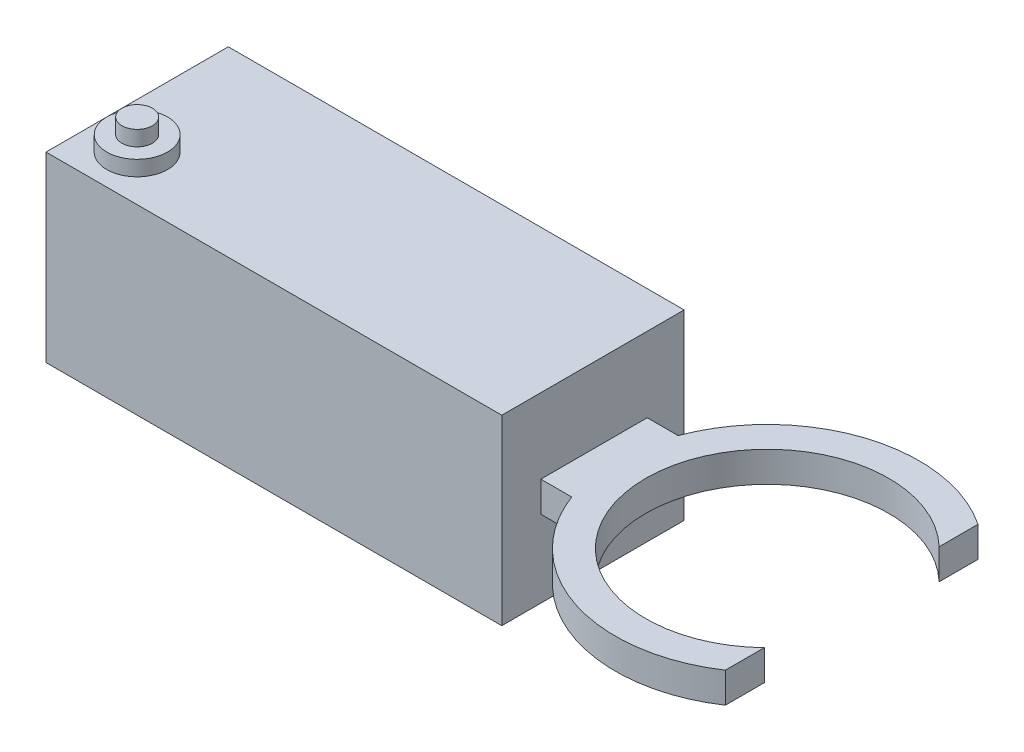
ISO-10303-21;
HEADER;
FILE_DESCRIPTION(('STEP AP214'),'2;1');
FILE_NAME('part.step','',(''),(''),'','','');
FILE_SCHEMA(('AUTOMOTIVE_DESIGN { 1 0 10303 214 1 1 1 1 }'));
ENDSEC;
DATA;
#1=APPLICATION_CONTEXT('core data for automotive mechanical design processes');
#2=APPLICATION_PROTOCOL_DEFINITION('international standard','automotive_design',2000,#1);
#3=PRODUCT_CONTEXT('',#1,'mechanical');
#4=PRODUCT('Part','Part','',(#3));
#5=PRODUCT_RELATED_PRODUCT_CATEGORY('part','',(#4));
#6=PRODUCT_DEFINITION_FORMATION('','',#4);
#7=PRODUCT_DEFINITION_CONTEXT('part definition',#1,'design');
#8=PRODUCT_DEFINITION('design','',#6,#7);
#9=PRODUCT_DEFINITION_SHAPE('','',#8);
#10=(LENGTH_UNIT() NAMED_UNIT(*) SI_UNIT(.MILLI.,.METRE.));
#11=(NAMED_UNIT(*) PLANE_ANGLE_UNIT() SI_UNIT($,.RADIAN.));
#12=(NAMED_UNIT(*) SI_UNIT($,.STERADIAN.) SOLID_ANGLE_UNIT());
#13=UNCERTAINTY_MEASURE_WITH_UNIT(LENGTH_MEASURE(1.E-05),#10,'distance_accuracy_value','');
#14=(GEOMETRIC_REPRESENTATION_CONTEXT(3) GLOBAL_UNCERTAINTY_ASSIGNED_CONTEXT((#13)) GLOBAL_UNIT_ASSIGNED_CONTEXT((#10,
#11,#12)) REPRESENTATION_CONTEXT('',''));
#15=CARTESIAN_POINT('',(0.,0.,0.));
#16=DIRECTION('',(0.,0.,1.));
#17=DIRECTION('',(1.,0.,0.));
#18=AXIS2_PLACEMENT_3D('',#15,#16,#17);
#19=CARTESIAN_POINT('',(75.,30.,-60.));
#20=DIRECTION('',(1.,0.,0.));
#21=DIRECTION('',(0.,0.,-1.));
#22=AXIS2_PLACEMENT_3D('',#19,#20,#21);
#23=PLANE('',#22);
#24=DIRECTION('',(0.,1.,0.));
#25=VECTOR('',#24,1.);
#26=CARTESIAN_POINT('',(75.,30.,0.));
#27=LINE('',#26,#25);
#28=CARTESIAN_POINT('',(75.,-30.,0.));
#29=VERTEX_POINT('',#28);
#30=CARTESIAN_POINT('',(75.,30.,0.));
#31=VERTEX_POINT('',#30);
#32=EDGE_CURVE('E223',#29,#31,#27,.T.);
#33=ORIENTED_EDGE('',*,*,#32,.F.);
#34=DIRECTION('',(0.,0.,1.));
#35=VECTOR('',#34,1.);
#36=CARTESIAN_POINT('',(75.,-30.,-60.));
#37=LINE('',#36,#35);
#38=CARTESIAN_POINT('',(75.,-30.,-60.));
#39=VERTEX_POINT('',#38);
#40=EDGE_CURVE('E228',#39,#29,#37,.T.);
#41=ORIENTED_EDGE('',*,*,#40,.F.);
#42=DIRECTION('',(0.,1.,0.));
#43=VECTOR('',#42,1.);
#44=CARTESIAN_POINT('',(75.,30.,-60.));
#45=LINE('',#44,#43);
#46=CARTESIAN_POINT('',(75.,30.,-60.));
#47=VERTEX_POINT('',#46);
#48=EDGE_CURVE('E212',#39,#47,#45,.T.);
#49=ORIENTED_EDGE('',*,*,#48,.T.);
#50=DIRECTION('',(0.,0.,1.));
#51=VECTOR('',#50,1.);
#52=CARTESIAN_POINT('',(75.,30.,-60.));
#53=LINE('',#52,#51);
#54=EDGE_CURVE('E44',#47,#31,#53,.T.);
#55=ORIENTED_EDGE('',*,*,#54,.T.);
#56=EDGE_LOOP('',(#33,#41,#49,#55));
#57=FACE_BOUND('',#56,.T.);
#58=DIRECTION('',(0.,0.,-1.));
#59=VECTOR('',#58,1.);
#60=CARTESIAN_POINT('',(75.,-4.65961704141354,-47.8619356874103));
#61=LINE('',#60,#59);
#62=CARTESIAN_POINT('',(75.,-4.65961704141354,-12.8619356874103));
#63=VERTEX_POINT('',#62);
#64=CARTESIAN_POINT('',(75.,-4.65961704141354,-47.8619356874103));
#65=VERTEX_POINT('',#64);
#66=EDGE_CURVE('E176',#63,#65,#61,.T.);
#67=ORIENTED_EDGE('',*,*,#66,.F.);
#68=DIRECTION('',(0.,-1.,0.));
#69=VECTOR('',#68,1.);
#70=CARTESIAN_POINT('',(75.,5.34038295858646,-12.8619356874103));
#71=LINE('',#70,#69);
#72=CARTESIAN_POINT('',(75.,5.34038295858646,-12.8619356874103));
#73=VERTEX_POINT('',#72);
#74=EDGE_CURVE('E174',#73,#63,#71,.T.);
#75=ORIENTED_EDGE('',*,*,#74,.F.);
#76=DIRECTION('',(0.,0.,1.));
#77=VECTOR('',#76,1.);
#78=CARTESIAN_POINT('',(75.,5.34038295858646,-47.8619356874103));
#79=LINE('',#78,#77);
#80=CARTESIAN_POINT('',(75.,5.34038295858646,-47.8619356874103));
#81=VERTEX_POINT('',#80);
#82=EDGE_CURVE('E182',#81,#73,#79,.T.);
#83=ORIENTED_EDGE('',*,*,#82,.F.);
#84=DIRECTION('',(0.,1.,0.));
#85=VECTOR('',#84,1.);
#86=CARTESIAN_POINT('',(75.,5.34038295858646,-47.8619356874103));
#87=LINE('',#86,#85);
#88=EDGE_CURVE('E179',#65,#81,#87,.T.);
#89=ORIENTED_EDGE('',*,*,#88,.F.);
#90=EDGE_LOOP('',(#67,#75,#83,#89));
#91=FACE_BOUND('',#90,.T.);
#92=ADVANCED_FACE('F35',(#57,#91),#23,.T.);
#93=CARTESIAN_POINT('',(-75.,30.,-60.));
#94=DIRECTION('',(-1.,0.,0.));
#95=DIRECTION('',(0.,-1.,0.));
#96=AXIS2_PLACEMENT_3D('',#93,#94,#95);
#97=PLANE('',#96);
#98=DIRECTION('',(0.,-1.,0.));
#99=VECTOR('',#98,1.);
#100=CARTESIAN_POINT('',(-75.,30.,0.));
#101=LINE('',#100,#99);
#102=CARTESIAN_POINT('',(-75.,30.,0.));
#103=VERTEX_POINT('',#102);
#104=CARTESIAN_POINT('',(-75.,-30.,0.));
#105=VERTEX_POINT('',#104);
#106=EDGE_CURVE('E202',#103,#105,#101,.T.);
#107=ORIENTED_EDGE('',*,*,#106,.F.);
#108=DIRECTION('',(0.,0.,1.));
#109=VECTOR('',#108,1.);
#110=CARTESIAN_POINT('',(-75.,30.,-60.));
#111=LINE('',#110,#109);
#112=CARTESIAN_POINT('',(-75.,30.,-60.));
#113=VERTEX_POINT('',#112);
#114=EDGE_CURVE('E11',#113,#103,#111,.T.);
#115=ORIENTED_EDGE('',*,*,#114,.F.);
#116=DIRECTION('',(0.,-1.,0.));
#117=VECTOR('',#116,1.);
#118=CARTESIAN_POINT('',(-75.,30.,-60.));
#119=LINE('',#118,#117);
#120=CARTESIAN_POINT('',(-75.,-30.,-60.));
#121=VERTEX_POINT('',#120);
#122=EDGE_CURVE('E205',#113,#121,#119,.T.);
#123=ORIENTED_EDGE('',*,*,#122,.T.);
#124=DIRECTION('',(0.,0.,1.));
#125=VECTOR('',#124,1.);
#126=CARTESIAN_POINT('',(-75.,-30.,-60.));
#127=LINE('',#126,#125);
#128=EDGE_CURVE('E39',#121,#105,#127,.T.);
#129=ORIENTED_EDGE('',*,*,#128,.T.);
#130=EDGE_LOOP('',(#107,#115,#123,#129));
#131=FACE_BOUND('',#130,.T.);
#132=ADVANCED_FACE('F37',(#131),#97,.T.);
#133=CARTESIAN_POINT('',(75.,30.,-60.));
#134=DIRECTION('',(0.,1.,0.));
#135=DIRECTION('',(0.,0.,1.));
#136=AXIS2_PLACEMENT_3D('',#133,#134,#135);
#137=PLANE('',#136);
#138=CARTESIAN_POINT('',(-60.,30.,-15.));
#139=DIRECTION('',(0.,1.,0.));
#140=DIRECTION('',(0.,0.,1.));
#141=AXIS2_PLACEMENT_3D('',#138,#139,#140);
#142=CIRCLE('',#141,10.);
#143=CARTESIAN_POINT('',(-60.,30.,-5.));
#144=VERTEX_POINT('',#143);
#145=EDGE_CURVE('E196',#144,#144,#142,.T.);
#146=ORIENTED_EDGE('',*,*,#145,.F.);
#147=EDGE_LOOP('',(#146));
#148=FACE_BOUND('',#147,.T.);
#149=DIRECTION('',(-1.,0.,0.));
#150=VECTOR('',#149,1.);
#151=CARTESIAN_POINT('',(75.,30.,0.));
#152=LINE('',#151,#150);
#153=EDGE_CURVE('E209',#31,#103,#152,.T.);
#154=ORIENTED_EDGE('',*,*,#153,.F.);
#155=ORIENTED_EDGE('',*,*,#54,.F.);
#156=DIRECTION('',(-1.,0.,0.));
#157=VECTOR('',#156,1.);
#158=CARTESIAN_POINT('',(75.,30.,-60.));
#159=LINE('',#158,#157);
#160=EDGE_CURVE('E215',#47,#113,#159,.T.);
#161=ORIENTED_EDGE('',*,*,#160,.T.);
#162=ORIENTED_EDGE('',*,*,#114,.T.);
#163=EDGE_LOOP('',(#154,#155,#161,#162));
#164=FACE_BOUND('',#163,.T.);
#165=ADVANCED_FACE('F241',(#148,#164),#137,.T.);
#166=CARTESIAN_POINT('',(75.,-30.,-60.));
#167=DIRECTION('',(0.,-1.,0.));
#168=DIRECTION('',(1.,0.,0.));
#169=AXIS2_PLACEMENT_3D('',#166,#167,#168);
#170=PLANE('',#169);
#171=DIRECTION('',(1.,0.,0.));
#172=VECTOR('',#171,1.);
#173=CARTESIAN_POINT('',(75.,-30.,0.));
#174=LINE('',#173,#172);
#175=EDGE_CURVE('E220',#105,#29,#174,.T.);
#176=ORIENTED_EDGE('',*,*,#175,.F.);
#177=ORIENTED_EDGE('',*,*,#128,.F.);
#178=DIRECTION('',(1.,0.,0.));
#179=VECTOR('',#178,1.);
#180=CARTESIAN_POINT('',(75.,-30.,-60.));
#181=LINE('',#180,#179);
#182=EDGE_CURVE('E208',#121,#39,#181,.T.);
#183=ORIENTED_EDGE('',*,*,#182,.T.);
#184=ORIENTED_EDGE('',*,*,#40,.T.);
#185=EDGE_LOOP('',(#176,#177,#183,#184));
#186=FACE_BOUND('',#185,.T.);
#187=ADVANCED_FACE('F236',(#186),#170,.T.);
#188=CARTESIAN_POINT('',(0.,0.,-60.));
#189=DIRECTION('',(0.,0.,-1.));
#190=DIRECTION('',(-1.,0.,0.));
#191=AXIS2_PLACEMENT_3D('',#188,#189,#190);
#192=PLANE('',#191);
#193=ORIENTED_EDGE('',*,*,#122,.F.);
#194=ORIENTED_EDGE('',*,*,#160,.F.);
#195=ORIENTED_EDGE('',*,*,#48,.F.);
#196=ORIENTED_EDGE('',*,*,#182,.F.);
#197=EDGE_LOOP('',(#193,#194,#195,#196));
#198=FACE_BOUND('',#197,.T.);
#199=ADVANCED_FACE('F244',(#198),#192,.T.);
#200=CARTESIAN_POINT('',(0.,0.,0.));
#201=DIRECTION('',(0.,0.,-1.));
#202=DIRECTION('',(-1.,0.,0.));
#203=AXIS2_PLACEMENT_3D('',#200,#201,#202);
#204=PLANE('',#203);
#205=ORIENTED_EDGE('',*,*,#106,.T.);
#206=ORIENTED_EDGE('',*,*,#175,.T.);
#207=ORIENTED_EDGE('',*,*,#32,.T.);
#208=ORIENTED_EDGE('',*,*,#153,.T.);
#209=EDGE_LOOP('',(#205,#206,#207,#208));
#210=FACE_BOUND('',#209,.T.);
#211=ADVANCED_FACE('F238',(#210),#204,.F.);
#212=CARTESIAN_POINT('',(-60.,35.,-15.));
#213=DIRECTION('',(0.,-1.,0.));
#214=DIRECTION('',(0.,0.,-1.));
#215=AXIS2_PLACEMENT_3D('',#212,#213,#214);
#216=CYLINDRICAL_SURFACE('',#215,10.);
#217=CARTESIAN_POINT('',(-60.,35.,-15.));
#218=DIRECTION('',(0.,1.,0.));
#219=DIRECTION('',(0.,0.,1.));
#220=AXIS2_PLACEMENT_3D('',#217,#218,#219);
#221=CIRCLE('',#220,10.);
#222=CARTESIAN_POINT('',(-60.,35.,-5.));
#223=VERTEX_POINT('',#222);
#224=EDGE_CURVE('E199',#223,#223,#221,.T.);
#225=ORIENTED_EDGE('',*,*,#224,.F.);
#226=EDGE_LOOP('',(#225));
#227=FACE_BOUND('',#226,.T.);
#228=ORIENTED_EDGE('',*,*,#145,.T.);
#229=EDGE_LOOP('',(#228));
#230=FACE_BOUND('',#229,.T.);
#231=ADVANCED_FACE('F284',(#227,#230),#216,.T.);
#232=CARTESIAN_POINT('',(-60.,35.,-15.));
#233=DIRECTION('',(0.,1.,0.));
#234=DIRECTION('',(0.,0.,1.));
#235=AXIS2_PLACEMENT_3D('',#232,#233,#234);
#236=PLANE('',#235);
#237=CARTESIAN_POINT('',(-60.,35.,-15.));
#238=DIRECTION('',(0.,1.,0.));
#239=DIRECTION('',(0.,0.,1.));
#240=AXIS2_PLACEMENT_3D('',#237,#238,#239);
#241=CIRCLE('',#240,5.);
#242=CARTESIAN_POINT('',(-60.,35.,-10.));
#243=VERTEX_POINT('',#242);
#244=EDGE_CURVE('E192',#243,#243,#241,.T.);
#245=ORIENTED_EDGE('',*,*,#244,.F.);
#246=EDGE_LOOP('',(#245));
#247=FACE_BOUND('',#246,.T.);
#248=ORIENTED_EDGE('',*,*,#224,.T.);
#249=EDGE_LOOP('',(#248));
#250=FACE_BOUND('',#249,.T.);
#251=ADVANCED_FACE('F280',(#247,#250),#236,.T.);
#252=CARTESIAN_POINT('',(-60.,40.,-15.));
#253=DIRECTION('',(0.,-1.,0.));
#254=DIRECTION('',(0.,0.,-1.));
#255=AXIS2_PLACEMENT_3D('',#252,#253,#254);
#256=CYLINDRICAL_SURFACE('',#255,5.);
#257=CARTESIAN_POINT('',(-60.,40.,-15.));
#258=DIRECTION('',(0.,1.,0.));
#259=DIRECTION('',(0.,0.,1.));
#260=AXIS2_PLACEMENT_3D('',#257,#258,#259);
#261=CIRCLE('',#260,5.);
#262=CARTESIAN_POINT('',(-60.,40.,-10.));
#263=VERTEX_POINT('',#262);
#264=EDGE_CURVE('E193',#263,#263,#261,.T.);
#265=ORIENTED_EDGE('',*,*,#264,.F.);
#266=EDGE_LOOP('',(#265));
#267=FACE_BOUND('',#266,.T.);
#268=ORIENTED_EDGE('',*,*,#244,.T.);
#269=EDGE_LOOP('',(#268));
#270=FACE_BOUND('',#269,.T.);
#271=ADVANCED_FACE('F276',(#267,#270),#256,.T.);
#272=CARTESIAN_POINT('',(-60.,40.,-15.));
#273=DIRECTION('',(0.,1.,0.));
#274=DIRECTION('',(0.,0.,1.));
#275=AXIS2_PLACEMENT_3D('',#272,#273,#274);
#276=PLANE('',#275);
#277=ORIENTED_EDGE('',*,*,#264,.T.);
#278=EDGE_LOOP('',(#277));
#279=FACE_BOUND('',#278,.T.);
#280=ADVANCED_FACE('F273',(#279),#276,.T.);
#281=CARTESIAN_POINT('',(90.,5.34038295858646,-12.8619356874103));
#282=DIRECTION('',(0.,0.,-1.));
#283=DIRECTION('',(-1.,0.,0.));
#284=AXIS2_PLACEMENT_3D('',#281,#282,#283);
#285=PLANE('',#284);
#286=DIRECTION('',(-1.,0.,0.));
#287=VECTOR('',#286,1.);
#288=CARTESIAN_POINT('',(90.,-4.65961704141354,-12.8619356874103));
#289=LINE('',#288,#287);
#290=CARTESIAN_POINT('',(85.162515012012,-4.65961704141354,-12.8619356874103));
#291=VERTEX_POINT('',#290);
#292=EDGE_CURVE('E52',#291,#63,#289,.T.);
#293=ORIENTED_EDGE('',*,*,#292,.F.);
#294=DIRECTION('',(0.,1.,0.));
#295=VECTOR('',#294,1.);
#296=CARTESIAN_POINT('',(85.162515012012,-4.65961704141354,-12.8619356874103));
#297=LINE('',#296,#295);
#298=CARTESIAN_POINT('',(85.162515012012,5.34038295858646,-12.8619356874103));
#299=VERTEX_POINT('',#298);
#300=EDGE_CURVE('E131',#291,#299,#297,.T.);
#301=ORIENTED_EDGE('',*,*,#300,.T.);
#302=DIRECTION('',(-1.,0.,0.));
#303=VECTOR('',#302,1.);
#304=CARTESIAN_POINT('',(90.,5.34038295858646,-12.8619356874103));
#305=LINE('',#304,#303);
#306=EDGE_CURVE('E185',#299,#73,#305,.T.);
#307=ORIENTED_EDGE('',*,*,#306,.T.);
#308=ORIENTED_EDGE('',*,*,#74,.T.);
#309=EDGE_LOOP('',(#293,#301,#307,#308));
#310=FACE_BOUND('',#309,.T.);
#311=ADVANCED_FACE('F255',(#310),#285,.F.);
#312=CARTESIAN_POINT('',(90.,-4.65961704141354,-47.8619356874103));
#313=DIRECTION('',(0.,1.,0.));
#314=DIRECTION('',(0.,0.,1.));
#315=AXIS2_PLACEMENT_3D('',#312,#313,#314);
#316=PLANE('',#315);
#317=CARTESIAN_POINT('',(132.,-4.65961704141354,-30.3619356874103));
#318=DIRECTION('',(0.,1.,0.));
#319=DIRECTION('',(0.,0.,1.));
#320=AXIS2_PLACEMENT_3D('',#317,#318,#319);
#321=CIRCLE('',#320,50.);
#322=CARTESIAN_POINT('',(159.790141342797,-4.65961704141355,11.2037718627732));
#323=VERTEX_POINT('',#322);
#324=EDGE_CURVE('E125',#291,#323,#321,.T.);
#325=ORIENTED_EDGE('',*,*,#324,.F.);
#326=ORIENTED_EDGE('',*,*,#292,.T.);
#327=ORIENTED_EDGE('',*,*,#66,.T.);
#328=DIRECTION('',(-1.,0.,0.));
#329=VECTOR('',#328,1.);
#330=CARTESIAN_POINT('',(90.,-4.65961704141354,-47.8619356874103));
#331=LINE('',#330,#329);
#332=CARTESIAN_POINT('',(85.162515012012,-4.65961704141354,-47.8619356874103));
#333=VERTEX_POINT('',#332);
#334=EDGE_CURVE('E189',#333,#65,#331,.T.);
#335=ORIENTED_EDGE('',*,*,#334,.F.);
#336=CARTESIAN_POINT('',(159.790141342797,-4.65961704141354,-71.9276432375938));
#337=VERTEX_POINT('',#336);
#338=EDGE_CURVE('E134',#337,#333,#321,.T.);
#339=ORIENTED_EDGE('',*,*,#338,.F.);
#340=DIRECTION('',(0.,0.,-1.));
#341=VECTOR('',#340,1.);
#342=CARTESIAN_POINT('',(159.790141342797,-4.65961704141354,-71.9276432375938));
#343=LINE('',#342,#341);
#344=CARTESIAN_POINT('',(159.790141342797,-4.65961704141354,-59.1318512963825));
#345=VERTEX_POINT('',#344);
#346=EDGE_CURVE('E144',#345,#337,#343,.T.);
#347=ORIENTED_EDGE('',*,*,#346,.F.);
#348=CARTESIAN_POINT('',(132.,-4.65961704141354,-30.3619356874103));
#349=DIRECTION('',(0.,-1.,0.));
#350=DIRECTION('',(0.,0.,1.));
#351=AXIS2_PLACEMENT_3D('',#348,#349,#350);
#352=CIRCLE('',#351,40.);
#353=CARTESIAN_POINT('',(159.790141342797,-4.65961704141355,-1.59202007843812));
#354=VERTEX_POINT('',#353);
#355=EDGE_CURVE('E150',#354,#345,#352,.T.);
#356=ORIENTED_EDGE('',*,*,#355,.F.);
#357=DIRECTION('',(0.,0.,-1.));
#358=VECTOR('',#357,1.);
#359=CARTESIAN_POINT('',(159.790141342797,-4.65961704141355,-1.59202007843812));
#360=LINE('',#359,#358);
#361=EDGE_CURVE('E140',#323,#354,#360,.T.);
#362=ORIENTED_EDGE('',*,*,#361,.F.);
#363=EDGE_LOOP('',(#325,#326,#327,#335,#339,#347,#356,#362));
#364=FACE_BOUND('',#363,.T.);
#365=ADVANCED_FACE('F147',(#364),#316,.F.);
#366=CARTESIAN_POINT('',(90.,5.34038295858646,-47.8619356874103));
#367=DIRECTION('',(0.,0.,1.));
#368=DIRECTION('',(1.,0.,0.));
#369=AXIS2_PLACEMENT_3D('',#366,#367,#368);
#370=PLANE('',#369);
#371=DIRECTION('',(-1.,0.,0.));
#372=VECTOR('',#371,1.);
#373=CARTESIAN_POINT('',(90.,5.34038295858646,-47.8619356874103));
#374=LINE('',#373,#372);
#375=CARTESIAN_POINT('',(85.162515012012,5.34038295858646,-47.8619356874103));
#376=VERTEX_POINT('',#375);
#377=EDGE_CURVE('E187',#376,#81,#374,.T.);
#378=ORIENTED_EDGE('',*,*,#377,.F.);
#379=DIRECTION('',(0.,1.,0.));
#380=VECTOR('',#379,1.);
#381=CARTESIAN_POINT('',(85.162515012012,-4.65961704141354,-47.8619356874103));
#382=LINE('',#381,#380);
#383=EDGE_CURVE('E60',#376,#333,#382,.F.);
#384=ORIENTED_EDGE('',*,*,#383,.T.);
#385=ORIENTED_EDGE('',*,*,#334,.T.);
#386=ORIENTED_EDGE('',*,*,#88,.T.);
#387=EDGE_LOOP('',(#378,#384,#385,#386));
#388=FACE_BOUND('',#387,.T.);
#389=ADVANCED_FACE('F260',(#388),#370,.F.);
#390=CARTESIAN_POINT('',(90.,5.34038295858646,-47.8619356874103));
#391=DIRECTION('',(0.,-1.,0.));
#392=DIRECTION('',(0.,0.,-1.));
#393=AXIS2_PLACEMENT_3D('',#390,#391,#392);
#394=PLANE('',#393);
#395=ORIENTED_EDGE('',*,*,#306,.F.);
#396=CARTESIAN_POINT('',(132.,5.34038295858646,-30.3619356874103));
#397=DIRECTION('',(0.,1.,0.));
#398=DIRECTION('',(0.,0.,1.));
#399=AXIS2_PLACEMENT_3D('',#396,#397,#398);
#400=CIRCLE('',#399,50.);
#401=CARTESIAN_POINT('',(159.790141342797,5.34038295858645,11.2037718627732));
#402=VERTEX_POINT('',#401);
#403=EDGE_CURVE('E160',#299,#402,#400,.T.);
#404=ORIENTED_EDGE('',*,*,#403,.T.);
#405=DIRECTION('',(0.,0.,-1.));
#406=VECTOR('',#405,1.);
#407=CARTESIAN_POINT('',(159.790141342797,5.34038295858645,-1.59202007843811));
#408=LINE('',#407,#406);
#409=CARTESIAN_POINT('',(159.790141342797,5.34038295858645,-1.59202007843811));
#410=VERTEX_POINT('',#409);
#411=EDGE_CURVE('E142',#402,#410,#408,.T.);
#412=ORIENTED_EDGE('',*,*,#411,.T.);
#413=CARTESIAN_POINT('',(132.,5.34038295858646,-30.3619356874103));
#414=DIRECTION('',(0.,-1.,0.));
#415=DIRECTION('',(0.,0.,1.));
#416=AXIS2_PLACEMENT_3D('',#413,#414,#415);
#417=CIRCLE('',#416,40.);
#418=CARTESIAN_POINT('',(159.790141342797,5.34038295858646,-59.1318512963825));
#419=VERTEX_POINT('',#418);
#420=EDGE_CURVE('E162',#410,#419,#417,.T.);
#421=ORIENTED_EDGE('',*,*,#420,.T.);
#422=DIRECTION('',(0.,0.,-1.));
#423=VECTOR('',#422,1.);
#424=CARTESIAN_POINT('',(159.790141342797,5.34038295858646,-71.9276432375938));
#425=LINE('',#424,#423);
#426=CARTESIAN_POINT('',(159.790141342797,5.34038295858646,-71.9276432375938));
#427=VERTEX_POINT('',#426);
#428=EDGE_CURVE('E135',#419,#427,#425,.T.);
#429=ORIENTED_EDGE('',*,*,#428,.T.);
#430=EDGE_CURVE('E157',#427,#376,#400,.T.);
#431=ORIENTED_EDGE('',*,*,#430,.T.);
#432=ORIENTED_EDGE('',*,*,#377,.T.);
#433=ORIENTED_EDGE('',*,*,#82,.T.);
#434=EDGE_LOOP('',(#395,#404,#412,#421,#429,#431,#432,#433));
#435=FACE_BOUND('',#434,.T.);
#436=ADVANCED_FACE('F258',(#435),#394,.F.);
#437=CARTESIAN_POINT('',(132.,-4.65961704141354,-30.3619356874103));
#438=DIRECTION('',(0.,1.,0.));
#439=DIRECTION('',(0.,0.,1.));
#440=AXIS2_PLACEMENT_3D('',#437,#438,#439);
#441=CYLINDRICAL_SURFACE('',#440,50.);
#442=ORIENTED_EDGE('',*,*,#300,.F.);
#443=ORIENTED_EDGE('',*,*,#324,.T.);
#444=DIRECTION('',(0.,1.,0.));
#445=VECTOR('',#444,1.);
#446=CARTESIAN_POINT('',(159.790141342797,-4.65961704141355,11.2037718627732));
#447=LINE('',#446,#445);
#448=EDGE_CURVE('E129',#323,#402,#447,.T.);
#449=ORIENTED_EDGE('',*,*,#448,.T.);
#450=ORIENTED_EDGE('',*,*,#403,.F.);
#451=EDGE_LOOP('',(#442,#443,#449,#450));
#452=FACE_BOUND('',#451,.T.);
#453=ADVANCED_FACE('F127',(#452),#441,.T.);
#454=ORIENTED_EDGE('',*,*,#383,.F.);
#455=ORIENTED_EDGE('',*,*,#430,.F.);
#456=DIRECTION('',(0.,1.,0.));
#457=VECTOR('',#456,1.);
#458=CARTESIAN_POINT('',(159.790141342797,-4.65961704141354,-71.9276432375938));
#459=LINE('',#458,#457);
#460=EDGE_CURVE('E167',#337,#427,#459,.T.);
#461=ORIENTED_EDGE('',*,*,#460,.F.);
#462=ORIENTED_EDGE('',*,*,#338,.T.);
#463=EDGE_LOOP('',(#454,#455,#461,#462));
#464=FACE_BOUND('',#463,.T.);
#465=ADVANCED_FACE('F359',(#464),#441,.T.);
#466=CARTESIAN_POINT('',(159.790141342797,-4.65961704141354,-71.9276432375938));
#467=DIRECTION('',(1.,0.,0.));
#468=DIRECTION('',(0.,0.,-1.));
#469=AXIS2_PLACEMENT_3D('',#466,#467,#468);
#470=PLANE('',#469);
#471=ORIENTED_EDGE('',*,*,#428,.F.);
#472=DIRECTION('',(0.,1.,0.));
#473=VECTOR('',#472,1.);
#474=CARTESIAN_POINT('',(159.790141342797,-4.65961704141354,-59.1318512963825));
#475=LINE('',#474,#473);
#476=EDGE_CURVE('E169',#345,#419,#475,.T.);
#477=ORIENTED_EDGE('',*,*,#476,.F.);
#478=ORIENTED_EDGE('',*,*,#346,.T.);
#479=ORIENTED_EDGE('',*,*,#460,.T.);
#480=EDGE_LOOP('',(#471,#477,#478,#479));
#481=FACE_BOUND('',#480,.T.);
#482=ADVANCED_FACE('F367',(#481),#470,.T.);
#483=CARTESIAN_POINT('',(132.,-4.65961704141354,-30.3619356874103));
#484=DIRECTION('',(0.,1.,0.));
#485=DIRECTION('',(0.,0.,1.));
#486=AXIS2_PLACEMENT_3D('',#483,#484,#485);
#487=CYLINDRICAL_SURFACE('',#486,40.);
#488=ORIENTED_EDGE('',*,*,#420,.F.);
#489=DIRECTION('',(0.,1.,0.));
#490=VECTOR('',#489,1.);
#491=CARTESIAN_POINT('',(159.790141342797,-4.65961704141355,-1.59202007843812));
#492=LINE('',#491,#490);
#493=EDGE_CURVE('E143',#354,#410,#492,.T.);
#494=ORIENTED_EDGE('',*,*,#493,.F.);
#495=ORIENTED_EDGE('',*,*,#355,.T.);
#496=ORIENTED_EDGE('',*,*,#476,.T.);
#497=EDGE_LOOP('',(#488,#494,#495,#496));
#498=FACE_BOUND('',#497,.T.);
#499=ADVANCED_FACE('F376',(#498),#487,.F.);
#500=CARTESIAN_POINT('',(159.790141342797,-4.65961704141355,-1.59202007843812));
#501=DIRECTION('',(1.,0.,0.));
#502=DIRECTION('',(0.,0.,-1.));
#503=AXIS2_PLACEMENT_3D('',#500,#501,#502);
#504=PLANE('',#503);
#505=ORIENTED_EDGE('',*,*,#411,.F.);
#506=ORIENTED_EDGE('',*,*,#448,.F.);
#507=ORIENTED_EDGE('',*,*,#361,.T.);
#508=ORIENTED_EDGE('',*,*,#493,.T.);
#509=EDGE_LOOP('',(#505,#506,#507,#508));
#510=FACE_BOUND('',#509,.T.);
#511=ADVANCED_FACE('F139',(#510),#504,.T.);
#512=CLOSED_SHELL('',(#92,#132,#165,#187,#199,#211,#231,#251,#271,#280,#311,#365,#389,#436,#453,
#465,#482,#499,#511));
#513=MANIFOLD_SOLID_BREP('B2',#512);
#514=ADVANCED_BREP_SHAPE_REPRESENTATION('',(#18,#513),#14);
#515=SHAPE_DEFINITION_REPRESENTATION(#9,#514);
ENDSEC;
END-ISO-10303-21;
